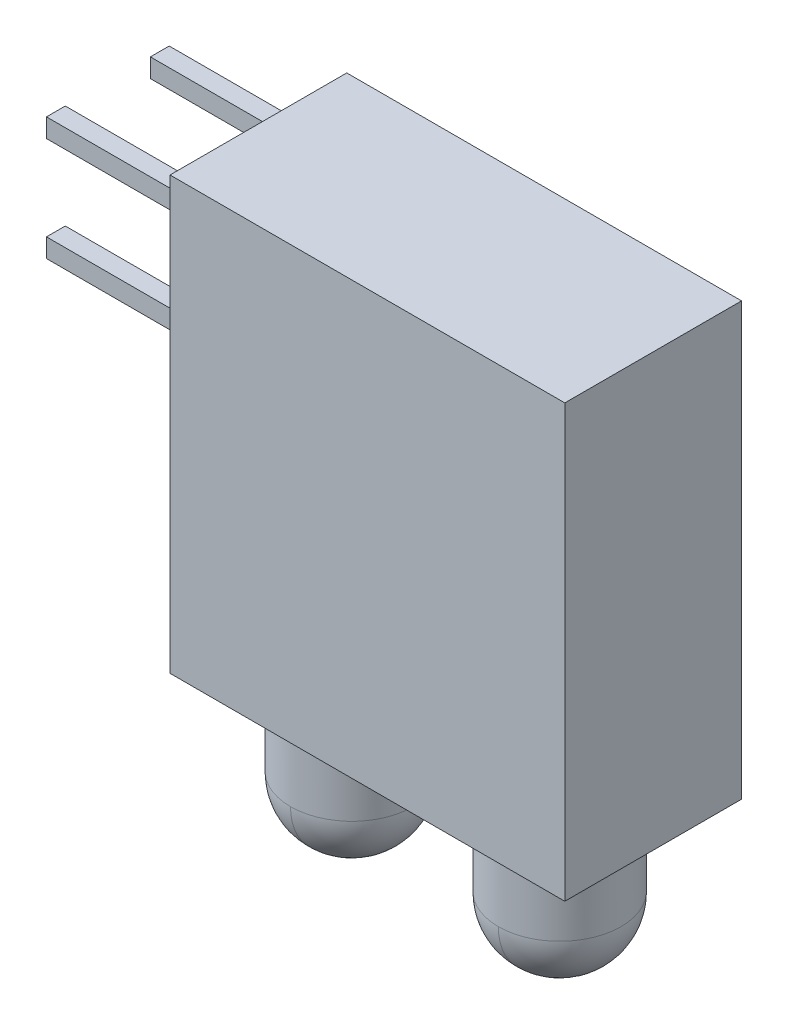
ISO-10303-21;
HEADER;
FILE_DESCRIPTION(('STEP AP214'),'2;1');
FILE_NAME('part.step','',(''),(''),'','','');
FILE_SCHEMA(('AUTOMOTIVE_DESIGN { 1 0 10303 214 1 1 1 1 }'));
ENDSEC;
DATA;
#1=APPLICATION_CONTEXT('core data for automotive mechanical design processes');
#2=APPLICATION_PROTOCOL_DEFINITION('international standard','automotive_design',2000,#1);
#3=PRODUCT_CONTEXT('',#1,'mechanical');
#4=PRODUCT('Part','Part','',(#3));
#5=PRODUCT_RELATED_PRODUCT_CATEGORY('part','',(#4));
#6=PRODUCT_DEFINITION_FORMATION('','',#4);
#7=PRODUCT_DEFINITION_CONTEXT('part definition',#1,'design');
#8=PRODUCT_DEFINITION('design','',#6,#7);
#9=PRODUCT_DEFINITION_SHAPE('','',#8);
#10=(LENGTH_UNIT() NAMED_UNIT(*) SI_UNIT(.MILLI.,.METRE.));
#11=(NAMED_UNIT(*) PLANE_ANGLE_UNIT() SI_UNIT($,.RADIAN.));
#12=(NAMED_UNIT(*) SI_UNIT($,.STERADIAN.) SOLID_ANGLE_UNIT());
#13=UNCERTAINTY_MEASURE_WITH_UNIT(LENGTH_MEASURE(1.E-05),#10,'distance_accuracy_value','');
#14=(GEOMETRIC_REPRESENTATION_CONTEXT(3) GLOBAL_UNCERTAINTY_ASSIGNED_CONTEXT((#13)) GLOBAL_UNIT_ASSIGNED_CONTEXT((#10,
#11,#12)) REPRESENTATION_CONTEXT('',''));
#15=CARTESIAN_POINT('',(0.,0.,0.));
#16=DIRECTION('',(0.,0.,1.));
#17=DIRECTION('',(1.,0.,0.));
#18=AXIS2_PLACEMENT_3D('',#15,#16,#17);
#19=CARTESIAN_POINT('',(15.3632892465154,-35.0510768898671,20.3900000000259));
#20=DIRECTION('',(0.,0.,-1.));
#21=DIRECTION('',(-1.,0.,0.));
#22=AXIS2_PLACEMENT_3D('',#19,#20,#21);
#23=PLANE('',#22);
#24=DIRECTION('',(1.,0.,0.));
#25=VECTOR('',#24,1.);
#26=CARTESIAN_POINT('',(15.3632892465154,-35.0510768898671,20.3900000000259));
#27=LINE('',#26,#25);
#28=CARTESIAN_POINT('',(5.71328924651546,-35.0510768898671,20.3900000000259));
#29=VERTEX_POINT('',#28);
#30=CARTESIAN_POINT('',(15.3632892465154,-35.0510768898671,20.3900000000259));
#31=VERTEX_POINT('',#30);
#32=EDGE_CURVE('E49',#29,#31,#27,.T.);
#33=ORIENTED_EDGE('',*,*,#32,.F.);
#34=DIRECTION('',(0.,1.,0.));
#35=VECTOR('',#34,1.);
#36=CARTESIAN_POINT('',(5.71328924651546,-35.0510768898671,20.3900000000259));
#37=LINE('',#36,#35);
#38=CARTESIAN_POINT('',(5.71328924651546,-45.6010768898671,20.3900000000259));
#39=VERTEX_POINT('',#38);
#40=EDGE_CURVE('E356',#39,#29,#37,.T.);
#41=ORIENTED_EDGE('',*,*,#40,.F.);
#42=DIRECTION('',(-1.,0.,0.));
#43=VECTOR('',#42,1.);
#44=CARTESIAN_POINT('',(15.3632892465154,-45.6010768898671,20.3900000000259));
#45=LINE('',#44,#43);
#46=CARTESIAN_POINT('',(15.3632892465154,-45.6010768898671,20.3900000000259));
#47=VERTEX_POINT('',#46);
#48=EDGE_CURVE('E305',#47,#39,#45,.T.);
#49=ORIENTED_EDGE('',*,*,#48,.F.);
#50=DIRECTION('',(0.,-1.,0.));
#51=VECTOR('',#50,1.);
#52=CARTESIAN_POINT('',(15.3632892465154,-35.0510768898671,20.3900000000259));
#53=LINE('',#52,#51);
#54=EDGE_CURVE('E11',#31,#47,#53,.T.);
#55=ORIENTED_EDGE('',*,*,#54,.F.);
#56=EDGE_LOOP('',(#33,#41,#49,#55));
#57=FACE_BOUND('',#56,.T.);
#58=ADVANCED_FACE('F16',(#57),#23,.F.);
#59=CARTESIAN_POINT('',(15.3632892465154,-40.3260768898671,18.2300000000259));
#60=DIRECTION('',(1.,0.,0.));
#61=DIRECTION('',(0.,1.,0.));
#62=AXIS2_PLACEMENT_3D('',#59,#60,#61);
#63=PLANE('',#62);
#64=DIRECTION('',(0.,0.,1.));
#65=VECTOR('',#64,1.);
#66=CARTESIAN_POINT('',(15.3632892465154,-35.0510768898671,18.2300000000259));
#67=LINE('',#66,#65);
#68=CARTESIAN_POINT('',(15.3632892465154,-35.0510768898671,16.0700000000259));
#69=VERTEX_POINT('',#68);
#70=EDGE_CURVE('E26',#69,#31,#67,.T.);
#71=ORIENTED_EDGE('',*,*,#70,.T.);
#72=ORIENTED_EDGE('',*,*,#54,.T.);
#73=DIRECTION('',(0.,0.,-1.));
#74=VECTOR('',#73,1.);
#75=CARTESIAN_POINT('',(15.3632892465154,-45.6010768898671,18.2300000000259));
#76=LINE('',#75,#74);
#77=CARTESIAN_POINT('',(15.3632892465154,-45.6010768898671,16.0700000000259));
#78=VERTEX_POINT('',#77);
#79=EDGE_CURVE('E205',#47,#78,#76,.T.);
#80=ORIENTED_EDGE('',*,*,#79,.T.);
#81=DIRECTION('',(0.,1.,0.));
#82=VECTOR('',#81,1.);
#83=CARTESIAN_POINT('',(15.3632892465154,-40.3260768898671,16.0700000000259));
#84=LINE('',#83,#82);
#85=EDGE_CURVE('E308',#78,#69,#84,.T.);
#86=ORIENTED_EDGE('',*,*,#85,.T.);
#87=EDGE_LOOP('',(#71,#72,#80,#86));
#88=FACE_BOUND('',#87,.T.);
#89=ADVANCED_FACE('F551',(#88),#63,.T.);
#90=CARTESIAN_POINT('',(15.3632892465154,-35.0510768898671,16.0700000000259));
#91=DIRECTION('',(0.,-1.,0.));
#92=DIRECTION('',(1.,0.,0.));
#93=AXIS2_PLACEMENT_3D('',#90,#91,#92);
#94=PLANE('',#93);
#95=DIRECTION('',(1.,0.,0.));
#96=VECTOR('',#95,1.);
#97=CARTESIAN_POINT('',(15.3632892465154,-35.0510768898671,16.0700000000259));
#98=LINE('',#97,#96);
#99=CARTESIAN_POINT('',(5.71328924651546,-35.0510768898671,16.0700000000259));
#100=VERTEX_POINT('',#99);
#101=EDGE_CURVE('E423',#100,#69,#98,.T.);
#102=ORIENTED_EDGE('',*,*,#101,.F.);
#103=DIRECTION('',(0.,0.,-1.));
#104=VECTOR('',#103,1.);
#105=CARTESIAN_POINT('',(5.71328924651546,-35.0510768898671,16.0700000000259));
#106=LINE('',#105,#104);
#107=EDGE_CURVE('E353',#29,#100,#106,.T.);
#108=ORIENTED_EDGE('',*,*,#107,.F.);
#109=ORIENTED_EDGE('',*,*,#32,.T.);
#110=ORIENTED_EDGE('',*,*,#70,.F.);
#111=EDGE_LOOP('',(#102,#108,#109,#110));
#112=FACE_BOUND('',#111,.T.);
#113=ADVANCED_FACE('F545',(#112),#94,.F.);
#114=CARTESIAN_POINT('',(5.71328924651546,-40.3260768898671,18.2300000000259));
#115=DIRECTION('',(1.,0.,0.));
#116=DIRECTION('',(0.,1.,0.));
#117=AXIS2_PLACEMENT_3D('',#114,#115,#116);
#118=PLANE('',#117);
#119=DIRECTION('',(0.,-1.,0.));
#120=VECTOR('',#119,1.);
#121=CARTESIAN_POINT('',(5.71328924651546,-36.4510768898671,19.7300000000259));
#122=LINE('',#121,#120);
#123=CARTESIAN_POINT('',(5.71328924651546,-35.9910768898671,19.7300000000259));
#124=VERTEX_POINT('',#123);
#125=CARTESIAN_POINT('',(5.71328924651546,-36.4510768898671,19.7300000000259));
#126=VERTEX_POINT('',#125);
#127=EDGE_CURVE('E303',#124,#126,#122,.T.);
#128=ORIENTED_EDGE('',*,*,#127,.T.);
#129=DIRECTION('',(0.,0.,-1.));
#130=VECTOR('',#129,1.);
#131=CARTESIAN_POINT('',(5.71328924651546,-36.4510768898671,19.2700000000259));
#132=LINE('',#131,#130);
#133=CARTESIAN_POINT('',(5.71328924651546,-36.4510768898671,19.2700000000259));
#134=VERTEX_POINT('',#133);
#135=EDGE_CURVE('E326',#126,#134,#132,.T.);
#136=ORIENTED_EDGE('',*,*,#135,.T.);
#137=DIRECTION('',(0.,1.,0.));
#138=VECTOR('',#137,1.);
#139=CARTESIAN_POINT('',(5.71328924651546,-35.9910768898671,19.2700000000259));
#140=LINE('',#139,#138);
#141=CARTESIAN_POINT('',(5.71328924651546,-35.9910768898671,19.2700000000259));
#142=VERTEX_POINT('',#141);
#143=EDGE_CURVE('E304',#134,#142,#140,.T.);
#144=ORIENTED_EDGE('',*,*,#143,.T.);
#145=DIRECTION('',(0.,0.,-1.));
#146=VECTOR('',#145,1.);
#147=CARTESIAN_POINT('',(5.71328924651546,-35.9910768898671,18.2300000000259));
#148=LINE('',#147,#146);
#149=EDGE_CURVE('E272',#124,#142,#148,.T.);
#150=ORIENTED_EDGE('',*,*,#149,.F.);
#151=EDGE_LOOP('',(#128,#136,#144,#150));
#152=FACE_BOUND('',#151,.T.);
#153=DIRECTION('',(0.,-1.,0.));
#154=VECTOR('',#153,1.);
#155=CARTESIAN_POINT('',(5.71328924651546,-38.9910768898671,19.7300000000259));
#156=LINE('',#155,#154);
#157=CARTESIAN_POINT('',(5.71328924651546,-38.5310768898671,19.7300000000259));
#158=VERTEX_POINT('',#157);
#159=CARTESIAN_POINT('',(5.71328924651546,-38.9910768898671,19.7300000000259));
#160=VERTEX_POINT('',#159);
#161=EDGE_CURVE('E312',#158,#160,#156,.T.);
#162=ORIENTED_EDGE('',*,*,#161,.T.);
#163=DIRECTION('',(0.,0.,-1.));
#164=VECTOR('',#163,1.);
#165=CARTESIAN_POINT('',(5.71328924651546,-38.9910768898671,19.2700000000259));
#166=LINE('',#165,#164);
#167=CARTESIAN_POINT('',(5.71328924651546,-38.9910768898671,19.2700000000259));
#168=VERTEX_POINT('',#167);
#169=EDGE_CURVE('E347',#160,#168,#166,.T.);
#170=ORIENTED_EDGE('',*,*,#169,.T.);
#171=DIRECTION('',(0.,1.,0.));
#172=VECTOR('',#171,1.);
#173=CARTESIAN_POINT('',(5.71328924651546,-38.5310768898671,19.2700000000259));
#174=LINE('',#173,#172);
#175=CARTESIAN_POINT('',(5.71328924651546,-38.5310768898671,19.2700000000259));
#176=VERTEX_POINT('',#175);
#177=EDGE_CURVE('E405',#168,#176,#174,.T.);
#178=ORIENTED_EDGE('',*,*,#177,.T.);
#179=DIRECTION('',(0.,0.,-1.));
#180=VECTOR('',#179,1.);
#181=CARTESIAN_POINT('',(5.71328924651546,-38.5310768898671,18.2300000000259));
#182=LINE('',#181,#180);
#183=EDGE_CURVE('E276',#158,#176,#182,.T.);
#184=ORIENTED_EDGE('',*,*,#183,.F.);
#185=EDGE_LOOP('',(#162,#170,#178,#184));
#186=FACE_BOUND('',#185,.T.);
#187=DIRECTION('',(0.,-1.,0.));
#188=VECTOR('',#187,1.);
#189=CARTESIAN_POINT('',(5.71328924651546,-36.4510768898671,17.1900000000259));
#190=LINE('',#189,#188);
#191=CARTESIAN_POINT('',(5.71328924651546,-35.9910768898671,17.1900000000259));
#192=VERTEX_POINT('',#191);
#193=CARTESIAN_POINT('',(5.71328924651546,-36.4510768898671,17.1900000000259));
#194=VERTEX_POINT('',#193);
#195=EDGE_CURVE('E254',#192,#194,#190,.T.);
#196=ORIENTED_EDGE('',*,*,#195,.T.);
#197=DIRECTION('',(0.,0.,-1.));
#198=VECTOR('',#197,1.);
#199=CARTESIAN_POINT('',(5.71328924651546,-36.4510768898671,16.7300000000259));
#200=LINE('',#199,#198);
#201=CARTESIAN_POINT('',(5.71328924651546,-36.4510768898671,16.7300000000259));
#202=VERTEX_POINT('',#201);
#203=EDGE_CURVE('E368',#194,#202,#200,.T.);
#204=ORIENTED_EDGE('',*,*,#203,.T.);
#205=DIRECTION('',(0.,1.,0.));
#206=VECTOR('',#205,1.);
#207=CARTESIAN_POINT('',(5.71328924651546,-35.9910768898671,16.7300000000259));
#208=LINE('',#207,#206);
#209=CARTESIAN_POINT('',(5.71328924651546,-35.9910768898671,16.7300000000259));
#210=VERTEX_POINT('',#209);
#211=EDGE_CURVE('E341',#202,#210,#208,.T.);
#212=ORIENTED_EDGE('',*,*,#211,.T.);
#213=DIRECTION('',(0.,0.,-1.));
#214=VECTOR('',#213,1.);
#215=CARTESIAN_POINT('',(5.71328924651546,-35.9910768898671,18.2300000000259));
#216=LINE('',#215,#214);
#217=EDGE_CURVE('E346',#192,#210,#216,.T.);
#218=ORIENTED_EDGE('',*,*,#217,.F.);
#219=EDGE_LOOP('',(#196,#204,#212,#218));
#220=FACE_BOUND('',#219,.T.);
#221=DIRECTION('',(0.,-1.,0.));
#222=VECTOR('',#221,1.);
#223=CARTESIAN_POINT('',(5.71328924651546,-38.9910768898671,17.1900000000259));
#224=LINE('',#223,#222);
#225=CARTESIAN_POINT('',(5.71328924651546,-38.5310768898671,17.1900000000259));
#226=VERTEX_POINT('',#225);
#227=CARTESIAN_POINT('',(5.71328924651546,-38.9910768898671,17.1900000000259));
#228=VERTEX_POINT('',#227);
#229=EDGE_CURVE('E292',#226,#228,#224,.T.);
#230=ORIENTED_EDGE('',*,*,#229,.T.);
#231=DIRECTION('',(0.,0.,-1.));
#232=VECTOR('',#231,1.);
#233=CARTESIAN_POINT('',(5.71328924651546,-38.9910768898671,16.7300000000259));
#234=LINE('',#233,#232);
#235=CARTESIAN_POINT('',(5.71328924651546,-38.9910768898671,16.7300000000259));
#236=VERTEX_POINT('',#235);
#237=EDGE_CURVE('E287',#228,#236,#234,.T.);
#238=ORIENTED_EDGE('',*,*,#237,.T.);
#239=DIRECTION('',(0.,1.,0.));
#240=VECTOR('',#239,1.);
#241=CARTESIAN_POINT('',(5.71328924651546,-38.5310768898671,16.7300000000259));
#242=LINE('',#241,#240);
#243=CARTESIAN_POINT('',(5.71328924651546,-38.5310768898671,16.7300000000259));
#244=VERTEX_POINT('',#243);
#245=EDGE_CURVE('E293',#236,#244,#242,.T.);
#246=ORIENTED_EDGE('',*,*,#245,.T.);
#247=DIRECTION('',(0.,0.,-1.));
#248=VECTOR('',#247,1.);
#249=CARTESIAN_POINT('',(5.71328924651546,-38.5310768898671,18.2300000000259));
#250=LINE('',#249,#248);
#251=EDGE_CURVE('E342',#226,#244,#250,.T.);
#252=ORIENTED_EDGE('',*,*,#251,.F.);
#253=EDGE_LOOP('',(#230,#238,#246,#252));
#254=FACE_BOUND('',#253,.T.);
#255=DIRECTION('',(0.,1.,0.));
#256=VECTOR('',#255,1.);
#257=CARTESIAN_POINT('',(5.71328924651546,-40.3260768898671,16.0700000000259));
#258=LINE('',#257,#256);
#259=CARTESIAN_POINT('',(5.71328924651546,-45.6010768898671,16.0700000000259));
#260=VERTEX_POINT('',#259);
#261=EDGE_CURVE('E419',#260,#100,#258,.T.);
#262=ORIENTED_EDGE('',*,*,#261,.F.);
#263=DIRECTION('',(0.,0.,-1.));
#264=VECTOR('',#263,1.);
#265=CARTESIAN_POINT('',(5.71328924651546,-45.6010768898671,18.2300000000259));
#266=LINE('',#265,#264);
#267=EDGE_CURVE('E193',#39,#260,#266,.T.);
#268=ORIENTED_EDGE('',*,*,#267,.F.);
#269=ORIENTED_EDGE('',*,*,#40,.T.);
#270=ORIENTED_EDGE('',*,*,#107,.T.);
#271=EDGE_LOOP('',(#262,#268,#269,#270));
#272=FACE_BOUND('',#271,.T.);
#273=ADVANCED_FACE('F550',(#152,#186,#220,#254,#272),#118,.F.);
#274=CARTESIAN_POINT('',(15.3632892465154,-45.6010768898671,20.3900000000259));
#275=DIRECTION('',(0.,1.,0.));
#276=DIRECTION('',(0.,0.,1.));
#277=AXIS2_PLACEMENT_3D('',#274,#275,#276);
#278=PLANE('',#277);
#279=CARTESIAN_POINT('',(13.0782892465155,-45.6010768898671,18.2300000000259));
#280=DIRECTION('',(0.,-1.,0.));
#281=DIRECTION('',(1.,0.,0.));
#282=AXIS2_PLACEMENT_3D('',#279,#280,#281);
#283=CIRCLE('',#282,1.5);
#284=CARTESIAN_POINT('',(11.5782892465155,-45.6010768898671,18.2300000000259));
#285=VERTEX_POINT('',#284);
#286=EDGE_CURVE('E397',#285,#285,#283,.T.);
#287=ORIENTED_EDGE('',*,*,#286,.F.);
#288=EDGE_LOOP('',(#287));
#289=FACE_BOUND('',#288,.T.);
#290=CARTESIAN_POINT('',(7.99828924651546,-45.6010768898671,18.2300000000259));
#291=DIRECTION('',(0.,-1.,0.));
#292=DIRECTION('',(1.,0.,0.));
#293=AXIS2_PLACEMENT_3D('',#290,#291,#292);
#294=CIRCLE('',#293,1.5);
#295=CARTESIAN_POINT('',(6.49828924651546,-45.6010768898671,18.2300000000259));
#296=VERTEX_POINT('',#295);
#297=EDGE_CURVE('E316',#296,#296,#294,.T.);
#298=ORIENTED_EDGE('',*,*,#297,.F.);
#299=EDGE_LOOP('',(#298));
#300=FACE_BOUND('',#299,.T.);
#301=ORIENTED_EDGE('',*,*,#48,.T.);
#302=ORIENTED_EDGE('',*,*,#267,.T.);
#303=DIRECTION('',(-1.,0.,0.));
#304=VECTOR('',#303,1.);
#305=CARTESIAN_POINT('',(15.3632892465154,-45.6010768898671,16.0700000000259));
#306=LINE('',#305,#304);
#307=EDGE_CURVE('E345',#78,#260,#306,.T.);
#308=ORIENTED_EDGE('',*,*,#307,.F.);
#309=ORIENTED_EDGE('',*,*,#79,.F.);
#310=EDGE_LOOP('',(#301,#302,#308,#309));
#311=FACE_BOUND('',#310,.T.);
#312=ADVANCED_FACE('F534',(#289,#300,#311),#278,.F.);
#313=CARTESIAN_POINT('',(15.3632892465154,-45.6010768898671,16.0700000000259));
#314=DIRECTION('',(0.,0.,1.));
#315=DIRECTION('',(0.,1.,0.));
#316=AXIS2_PLACEMENT_3D('',#313,#314,#315);
#317=PLANE('',#316);
#318=ORIENTED_EDGE('',*,*,#307,.T.);
#319=ORIENTED_EDGE('',*,*,#261,.T.);
#320=ORIENTED_EDGE('',*,*,#101,.T.);
#321=ORIENTED_EDGE('',*,*,#85,.F.);
#322=EDGE_LOOP('',(#318,#319,#320,#321));
#323=FACE_BOUND('',#322,.T.);
#324=ADVANCED_FACE('F529',(#323),#317,.F.);
#325=CARTESIAN_POINT('',(2.03328924651546,-38.5310768898671,17.1900000000259));
#326=DIRECTION('',(0.,-1.,0.));
#327=DIRECTION('',(1.,0.,0.));
#328=AXIS2_PLACEMENT_3D('',#325,#326,#327);
#329=PLANE('',#328);
#330=DIRECTION('',(-1.,0.,0.));
#331=VECTOR('',#330,1.);
#332=CARTESIAN_POINT('',(2.03328924651546,-38.5310768898671,17.1900000000259));
#333=LINE('',#332,#331);
#334=CARTESIAN_POINT('',(2.03328924651546,-38.5310768898671,17.1900000000259));
#335=VERTEX_POINT('',#334);
#336=EDGE_CURVE('E430',#226,#335,#333,.T.);
#337=ORIENTED_EDGE('',*,*,#336,.F.);
#338=ORIENTED_EDGE('',*,*,#251,.T.);
#339=DIRECTION('',(1.,0.,0.));
#340=VECTOR('',#339,1.);
#341=CARTESIAN_POINT('',(2.03328924651546,-38.5310768898671,16.7300000000259));
#342=LINE('',#341,#340);
#343=CARTESIAN_POINT('',(2.03328924651546,-38.5310768898671,16.7300000000259));
#344=VERTEX_POINT('',#343);
#345=EDGE_CURVE('E242',#344,#244,#342,.T.);
#346=ORIENTED_EDGE('',*,*,#345,.F.);
#347=DIRECTION('',(0.,0.,-1.));
#348=VECTOR('',#347,1.);
#349=CARTESIAN_POINT('',(2.03328924651546,-38.5310768898671,17.1900000000259));
#350=LINE('',#349,#348);
#351=EDGE_CURVE('E277',#335,#344,#350,.T.);
#352=ORIENTED_EDGE('',*,*,#351,.F.);
#353=EDGE_LOOP('',(#337,#338,#346,#352));
#354=FACE_BOUND('',#353,.T.);
#355=ADVANCED_FACE('F480',(#354),#329,.F.);
#356=CARTESIAN_POINT('',(2.03328924651546,-35.9910768898671,17.1900000000259));
#357=DIRECTION('',(0.,-1.,0.));
#358=DIRECTION('',(1.,0.,0.));
#359=AXIS2_PLACEMENT_3D('',#356,#357,#358);
#360=PLANE('',#359);
#361=DIRECTION('',(-1.,0.,0.));
#362=VECTOR('',#361,1.);
#363=CARTESIAN_POINT('',(2.03328924651546,-35.9910768898671,17.1900000000259));
#364=LINE('',#363,#362);
#365=CARTESIAN_POINT('',(2.03328924651546,-35.9910768898671,17.1900000000259));
#366=VERTEX_POINT('',#365);
#367=EDGE_CURVE('E235',#192,#366,#364,.T.);
#368=ORIENTED_EDGE('',*,*,#367,.F.);
#369=ORIENTED_EDGE('',*,*,#217,.T.);
#370=DIRECTION('',(1.,0.,0.));
#371=VECTOR('',#370,1.);
#372=CARTESIAN_POINT('',(2.03328924651546,-35.9910768898671,16.7300000000259));
#373=LINE('',#372,#371);
#374=CARTESIAN_POINT('',(2.03328924651546,-35.9910768898671,16.7300000000259));
#375=VERTEX_POINT('',#374);
#376=EDGE_CURVE('E238',#375,#210,#373,.T.);
#377=ORIENTED_EDGE('',*,*,#376,.F.);
#378=DIRECTION('',(0.,0.,-1.));
#379=VECTOR('',#378,1.);
#380=CARTESIAN_POINT('',(2.03328924651546,-35.9910768898671,17.1900000000259));
#381=LINE('',#380,#379);
#382=EDGE_CURVE('E231',#366,#375,#381,.T.);
#383=ORIENTED_EDGE('',*,*,#382,.F.);
#384=EDGE_LOOP('',(#368,#369,#377,#383));
#385=FACE_BOUND('',#384,.T.);
#386=ADVANCED_FACE('F233',(#385),#360,.F.);
#387=CARTESIAN_POINT('',(2.03328924651546,-38.5310768898671,19.7300000000259));
#388=DIRECTION('',(0.,-1.,0.));
#389=DIRECTION('',(1.,0.,0.));
#390=AXIS2_PLACEMENT_3D('',#387,#388,#389);
#391=PLANE('',#390);
#392=DIRECTION('',(-1.,0.,0.));
#393=VECTOR('',#392,1.);
#394=CARTESIAN_POINT('',(2.03328924651546,-38.5310768898671,19.7300000000259));
#395=LINE('',#394,#393);
#396=CARTESIAN_POINT('',(2.03328924651546,-38.5310768898671,19.7300000000259));
#397=VERTEX_POINT('',#396);
#398=EDGE_CURVE('E283',#158,#397,#395,.T.);
#399=ORIENTED_EDGE('',*,*,#398,.F.);
#400=ORIENTED_EDGE('',*,*,#183,.T.);
#401=DIRECTION('',(1.,0.,0.));
#402=VECTOR('',#401,1.);
#403=CARTESIAN_POINT('',(2.03328924651546,-38.5310768898671,19.2700000000259));
#404=LINE('',#403,#402);
#405=CARTESIAN_POINT('',(2.03328924651546,-38.5310768898671,19.2700000000259));
#406=VERTEX_POINT('',#405);
#407=EDGE_CURVE('E269',#406,#176,#404,.T.);
#408=ORIENTED_EDGE('',*,*,#407,.F.);
#409=DIRECTION('',(0.,0.,-1.));
#410=VECTOR('',#409,1.);
#411=CARTESIAN_POINT('',(2.03328924651546,-38.5310768898671,19.7300000000259));
#412=LINE('',#411,#410);
#413=EDGE_CURVE('E282',#397,#406,#412,.T.);
#414=ORIENTED_EDGE('',*,*,#413,.F.);
#415=EDGE_LOOP('',(#399,#400,#408,#414));
#416=FACE_BOUND('',#415,.T.);
#417=ADVANCED_FACE('F653',(#416),#391,.F.);
#418=CARTESIAN_POINT('',(2.03328924651546,-35.9910768898671,19.7300000000259));
#419=DIRECTION('',(0.,-1.,0.));
#420=DIRECTION('',(1.,0.,0.));
#421=AXIS2_PLACEMENT_3D('',#418,#419,#420);
#422=PLANE('',#421);
#423=DIRECTION('',(-1.,0.,0.));
#424=VECTOR('',#423,1.);
#425=CARTESIAN_POINT('',(2.03328924651546,-35.9910768898671,19.7300000000259));
#426=LINE('',#425,#424);
#427=CARTESIAN_POINT('',(2.03328924651546,-35.9910768898671,19.7300000000259));
#428=VERTEX_POINT('',#427);
#429=EDGE_CURVE('E335',#124,#428,#426,.T.);
#430=ORIENTED_EDGE('',*,*,#429,.F.);
#431=ORIENTED_EDGE('',*,*,#149,.T.);
#432=DIRECTION('',(1.,0.,0.));
#433=VECTOR('',#432,1.);
#434=CARTESIAN_POINT('',(2.03328924651546,-35.9910768898671,19.2700000000259));
#435=LINE('',#434,#433);
#436=CARTESIAN_POINT('',(2.03328924651546,-35.9910768898671,19.2700000000259));
#437=VERTEX_POINT('',#436);
#438=EDGE_CURVE('E357',#437,#142,#435,.T.);
#439=ORIENTED_EDGE('',*,*,#438,.F.);
#440=DIRECTION('',(0.,0.,-1.));
#441=VECTOR('',#440,1.);
#442=CARTESIAN_POINT('',(2.03328924651546,-35.9910768898671,19.7300000000259));
#443=LINE('',#442,#441);
#444=EDGE_CURVE('E268',#428,#437,#443,.T.);
#445=ORIENTED_EDGE('',*,*,#444,.F.);
#446=EDGE_LOOP('',(#430,#431,#439,#445));
#447=FACE_BOUND('',#446,.T.);
#448=ADVANCED_FACE('F648',(#447),#422,.F.);
#449=CARTESIAN_POINT('',(2.03328924651546,-40.3260768898671,18.2300000000259));
#450=DIRECTION('',(-1.,0.,0.));
#451=DIRECTION('',(0.,0.,-1.));
#452=AXIS2_PLACEMENT_3D('',#449,#450,#451);
#453=PLANE('',#452);
#454=ORIENTED_EDGE('',*,*,#351,.T.);
#455=DIRECTION('',(0.,-1.,0.));
#456=VECTOR('',#455,1.);
#457=CARTESIAN_POINT('',(2.03328924651546,-40.3260768898671,16.7300000000259));
#458=LINE('',#457,#456);
#459=CARTESIAN_POINT('',(2.03328924651546,-38.9910768898671,16.7300000000259));
#460=VERTEX_POINT('',#459);
#461=EDGE_CURVE('E289',#344,#460,#458,.T.);
#462=ORIENTED_EDGE('',*,*,#461,.T.);
#463=DIRECTION('',(0.,0.,1.));
#464=VECTOR('',#463,1.);
#465=CARTESIAN_POINT('',(2.03328924651546,-38.9910768898671,16.7300000000259));
#466=LINE('',#465,#464);
#467=CARTESIAN_POINT('',(2.03328924651546,-38.9910768898671,17.1900000000259));
#468=VERTEX_POINT('',#467);
#469=EDGE_CURVE('E361',#460,#468,#466,.T.);
#470=ORIENTED_EDGE('',*,*,#469,.T.);
#471=DIRECTION('',(0.,1.,0.));
#472=VECTOR('',#471,1.);
#473=CARTESIAN_POINT('',(2.03328924651546,-40.3260768898671,17.1900000000259));
#474=LINE('',#473,#472);
#475=EDGE_CURVE('E311',#468,#335,#474,.T.);
#476=ORIENTED_EDGE('',*,*,#475,.T.);
#477=EDGE_LOOP('',(#454,#462,#470,#476));
#478=FACE_BOUND('',#477,.T.);
#479=ADVANCED_FACE('F472',(#478),#453,.T.);
#480=CARTESIAN_POINT('',(2.03328924651546,-38.9910768898671,17.1900000000259));
#481=DIRECTION('',(0.,0.,-1.));
#482=DIRECTION('',(-1.,0.,0.));
#483=AXIS2_PLACEMENT_3D('',#480,#481,#482);
#484=PLANE('',#483);
#485=DIRECTION('',(-1.,0.,0.));
#486=VECTOR('',#485,1.);
#487=CARTESIAN_POINT('',(2.03328924651546,-38.9910768898671,17.1900000000259));
#488=LINE('',#487,#486);
#489=EDGE_CURVE('E369',#228,#468,#488,.T.);
#490=ORIENTED_EDGE('',*,*,#489,.F.);
#491=ORIENTED_EDGE('',*,*,#229,.F.);
#492=ORIENTED_EDGE('',*,*,#336,.T.);
#493=ORIENTED_EDGE('',*,*,#475,.F.);
#494=EDGE_LOOP('',(#490,#491,#492,#493));
#495=FACE_BOUND('',#494,.T.);
#496=ADVANCED_FACE('F18',(#495),#484,.F.);
#497=CARTESIAN_POINT('',(2.03328924651546,-38.5310768898671,16.7300000000259));
#498=DIRECTION('',(0.,0.,1.));
#499=DIRECTION('',(0.,1.,0.));
#500=AXIS2_PLACEMENT_3D('',#497,#498,#499);
#501=PLANE('',#500);
#502=ORIENTED_EDGE('',*,*,#345,.T.);
#503=ORIENTED_EDGE('',*,*,#245,.F.);
#504=DIRECTION('',(1.,0.,0.));
#505=VECTOR('',#504,1.);
#506=CARTESIAN_POINT('',(2.03328924651546,-38.9910768898671,16.7300000000259));
#507=LINE('',#506,#505);
#508=EDGE_CURVE('E284',#460,#236,#507,.T.);
#509=ORIENTED_EDGE('',*,*,#508,.F.);
#510=ORIENTED_EDGE('',*,*,#461,.F.);
#511=EDGE_LOOP('',(#502,#503,#509,#510));
#512=FACE_BOUND('',#511,.T.);
#513=ADVANCED_FACE('F483',(#512),#501,.F.);
#514=CARTESIAN_POINT('',(2.03328924651546,-40.3260768898671,18.2300000000259));
#515=DIRECTION('',(-1.,0.,0.));
#516=DIRECTION('',(0.,0.,-1.));
#517=AXIS2_PLACEMENT_3D('',#514,#515,#516);
#518=PLANE('',#517);
#519=ORIENTED_EDGE('',*,*,#382,.T.);
#520=DIRECTION('',(0.,-1.,0.));
#521=VECTOR('',#520,1.);
#522=CARTESIAN_POINT('',(2.03328924651546,-40.3260768898671,16.7300000000259));
#523=LINE('',#522,#521);
#524=CARTESIAN_POINT('',(2.03328924651546,-36.4510768898671,16.7300000000259));
#525=VERTEX_POINT('',#524);
#526=EDGE_CURVE('E262',#375,#525,#523,.T.);
#527=ORIENTED_EDGE('',*,*,#526,.T.);
#528=DIRECTION('',(0.,0.,1.));
#529=VECTOR('',#528,1.);
#530=CARTESIAN_POINT('',(2.03328924651546,-36.4510768898671,16.7300000000259));
#531=LINE('',#530,#529);
#532=CARTESIAN_POINT('',(2.03328924651546,-36.4510768898671,17.1900000000259));
#533=VERTEX_POINT('',#532);
#534=EDGE_CURVE('E20',#525,#533,#531,.T.);
#535=ORIENTED_EDGE('',*,*,#534,.T.);
#536=DIRECTION('',(0.,1.,0.));
#537=VECTOR('',#536,1.);
#538=CARTESIAN_POINT('',(2.03328924651546,-40.3260768898671,17.1900000000259));
#539=LINE('',#538,#537);
#540=EDGE_CURVE('E243',#533,#366,#539,.T.);
#541=ORIENTED_EDGE('',*,*,#540,.T.);
#542=EDGE_LOOP('',(#519,#527,#535,#541));
#543=FACE_BOUND('',#542,.T.);
#544=ADVANCED_FACE('F246',(#543),#518,.T.);
#545=CARTESIAN_POINT('',(2.03328924651546,-36.4510768898671,17.1900000000259));
#546=DIRECTION('',(0.,0.,-1.));
#547=DIRECTION('',(-1.,0.,0.));
#548=AXIS2_PLACEMENT_3D('',#545,#546,#547);
#549=PLANE('',#548);
#550=DIRECTION('',(-1.,0.,0.));
#551=VECTOR('',#550,1.);
#552=CARTESIAN_POINT('',(2.03328924651546,-36.4510768898671,17.1900000000259));
#553=LINE('',#552,#551);
#554=EDGE_CURVE('E412',#194,#533,#553,.T.);
#555=ORIENTED_EDGE('',*,*,#554,.F.);
#556=ORIENTED_EDGE('',*,*,#195,.F.);
#557=ORIENTED_EDGE('',*,*,#367,.T.);
#558=ORIENTED_EDGE('',*,*,#540,.F.);
#559=EDGE_LOOP('',(#555,#556,#557,#558));
#560=FACE_BOUND('',#559,.T.);
#561=ADVANCED_FACE('F253',(#560),#549,.F.);
#562=CARTESIAN_POINT('',(2.03328924651546,-35.9910768898671,16.7300000000259));
#563=DIRECTION('',(0.,0.,1.));
#564=DIRECTION('',(0.,1.,0.));
#565=AXIS2_PLACEMENT_3D('',#562,#563,#564);
#566=PLANE('',#565);
#567=ORIENTED_EDGE('',*,*,#376,.T.);
#568=ORIENTED_EDGE('',*,*,#211,.F.);
#569=DIRECTION('',(1.,0.,0.));
#570=VECTOR('',#569,1.);
#571=CARTESIAN_POINT('',(2.03328924651546,-36.4510768898671,16.7300000000259));
#572=LINE('',#571,#570);
#573=EDGE_CURVE('E364',#525,#202,#572,.T.);
#574=ORIENTED_EDGE('',*,*,#573,.F.);
#575=ORIENTED_EDGE('',*,*,#526,.F.);
#576=EDGE_LOOP('',(#567,#568,#574,#575));
#577=FACE_BOUND('',#576,.T.);
#578=ADVANCED_FACE('F697',(#577),#566,.F.);
#579=CARTESIAN_POINT('',(2.03328924651546,-40.3260768898671,18.2300000000259));
#580=DIRECTION('',(-1.,0.,0.));
#581=DIRECTION('',(0.,0.,-1.));
#582=AXIS2_PLACEMENT_3D('',#579,#580,#581);
#583=PLANE('',#582);
#584=ORIENTED_EDGE('',*,*,#413,.T.);
#585=DIRECTION('',(0.,-1.,0.));
#586=VECTOR('',#585,1.);
#587=CARTESIAN_POINT('',(2.03328924651546,-40.3260768898671,19.2700000000259));
#588=LINE('',#587,#586);
#589=CARTESIAN_POINT('',(2.03328924651546,-38.9910768898671,19.2700000000259));
#590=VERTEX_POINT('',#589);
#591=EDGE_CURVE('E315',#406,#590,#588,.T.);
#592=ORIENTED_EDGE('',*,*,#591,.T.);
#593=DIRECTION('',(0.,0.,1.));
#594=VECTOR('',#593,1.);
#595=CARTESIAN_POINT('',(2.03328924651546,-38.9910768898671,19.2700000000259));
#596=LINE('',#595,#594);
#597=CARTESIAN_POINT('',(2.03328924651546,-38.9910768898671,19.7300000000259));
#598=VERTEX_POINT('',#597);
#599=EDGE_CURVE('E266',#590,#598,#596,.T.);
#600=ORIENTED_EDGE('',*,*,#599,.T.);
#601=DIRECTION('',(0.,1.,0.));
#602=VECTOR('',#601,1.);
#603=CARTESIAN_POINT('',(2.03328924651546,-40.3260768898671,19.7300000000259));
#604=LINE('',#603,#602);
#605=EDGE_CURVE('E278',#598,#397,#604,.T.);
#606=ORIENTED_EDGE('',*,*,#605,.T.);
#607=EDGE_LOOP('',(#584,#592,#600,#606));
#608=FACE_BOUND('',#607,.T.);
#609=ADVANCED_FACE('F605',(#608),#583,.T.);
#610=CARTESIAN_POINT('',(2.03328924651546,-38.9910768898671,19.7300000000259));
#611=DIRECTION('',(0.,0.,-1.));
#612=DIRECTION('',(-1.,0.,0.));
#613=AXIS2_PLACEMENT_3D('',#610,#611,#612);
#614=PLANE('',#613);
#615=DIRECTION('',(-1.,0.,0.));
#616=VECTOR('',#615,1.);
#617=CARTESIAN_POINT('',(2.03328924651546,-38.9910768898671,19.7300000000259));
#618=LINE('',#617,#616);
#619=EDGE_CURVE('E351',#160,#598,#618,.T.);
#620=ORIENTED_EDGE('',*,*,#619,.F.);
#621=ORIENTED_EDGE('',*,*,#161,.F.);
#622=ORIENTED_EDGE('',*,*,#398,.T.);
#623=ORIENTED_EDGE('',*,*,#605,.F.);
#624=EDGE_LOOP('',(#620,#621,#622,#623));
#625=FACE_BOUND('',#624,.T.);
#626=ADVANCED_FACE('F599',(#625),#614,.F.);
#627=CARTESIAN_POINT('',(2.03328924651546,-38.5310768898671,19.2700000000259));
#628=DIRECTION('',(0.,0.,1.));
#629=DIRECTION('',(0.,1.,0.));
#630=AXIS2_PLACEMENT_3D('',#627,#628,#629);
#631=PLANE('',#630);
#632=ORIENTED_EDGE('',*,*,#407,.T.);
#633=ORIENTED_EDGE('',*,*,#177,.F.);
#634=DIRECTION('',(1.,0.,0.));
#635=VECTOR('',#634,1.);
#636=CARTESIAN_POINT('',(2.03328924651546,-38.9910768898671,19.2700000000259));
#637=LINE('',#636,#635);
#638=EDGE_CURVE('E352',#590,#168,#637,.T.);
#639=ORIENTED_EDGE('',*,*,#638,.F.);
#640=ORIENTED_EDGE('',*,*,#591,.F.);
#641=EDGE_LOOP('',(#632,#633,#639,#640));
#642=FACE_BOUND('',#641,.T.);
#643=ADVANCED_FACE('F604',(#642),#631,.F.);
#644=CARTESIAN_POINT('',(2.03328924651546,-40.3260768898671,18.2300000000259));
#645=DIRECTION('',(-1.,0.,0.));
#646=DIRECTION('',(0.,0.,-1.));
#647=AXIS2_PLACEMENT_3D('',#644,#645,#646);
#648=PLANE('',#647);
#649=ORIENTED_EDGE('',*,*,#444,.T.);
#650=DIRECTION('',(0.,-1.,0.));
#651=VECTOR('',#650,1.);
#652=CARTESIAN_POINT('',(2.03328924651546,-40.3260768898671,19.2700000000259));
#653=LINE('',#652,#651);
#654=CARTESIAN_POINT('',(2.03328924651546,-36.4510768898671,19.2700000000259));
#655=VERTEX_POINT('',#654);
#656=EDGE_CURVE('E300',#437,#655,#653,.T.);
#657=ORIENTED_EDGE('',*,*,#656,.T.);
#658=DIRECTION('',(0.,0.,1.));
#659=VECTOR('',#658,1.);
#660=CARTESIAN_POINT('',(2.03328924651546,-36.4510768898671,19.2700000000259));
#661=LINE('',#660,#659);
#662=CARTESIAN_POINT('',(2.03328924651546,-36.4510768898671,19.7300000000259));
#663=VERTEX_POINT('',#662);
#664=EDGE_CURVE('E390',#655,#663,#661,.T.);
#665=ORIENTED_EDGE('',*,*,#664,.T.);
#666=DIRECTION('',(0.,1.,0.));
#667=VECTOR('',#666,1.);
#668=CARTESIAN_POINT('',(2.03328924651546,-40.3260768898671,19.7300000000259));
#669=LINE('',#668,#667);
#670=EDGE_CURVE('E270',#663,#428,#669,.T.);
#671=ORIENTED_EDGE('',*,*,#670,.T.);
#672=EDGE_LOOP('',(#649,#657,#665,#671));
#673=FACE_BOUND('',#672,.T.);
#674=ADVANCED_FACE('F622',(#673),#648,.T.);
#675=CARTESIAN_POINT('',(2.03328924651546,-36.4510768898671,19.7300000000259));
#676=DIRECTION('',(0.,0.,-1.));
#677=DIRECTION('',(-1.,0.,0.));
#678=AXIS2_PLACEMENT_3D('',#675,#676,#677);
#679=PLANE('',#678);
#680=DIRECTION('',(-1.,0.,0.));
#681=VECTOR('',#680,1.);
#682=CARTESIAN_POINT('',(2.03328924651546,-36.4510768898671,19.7300000000259));
#683=LINE('',#682,#681);
#684=EDGE_CURVE('E330',#126,#663,#683,.T.);
#685=ORIENTED_EDGE('',*,*,#684,.F.);
#686=ORIENTED_EDGE('',*,*,#127,.F.);
#687=ORIENTED_EDGE('',*,*,#429,.T.);
#688=ORIENTED_EDGE('',*,*,#670,.F.);
#689=EDGE_LOOP('',(#685,#686,#687,#688));
#690=FACE_BOUND('',#689,.T.);
#691=ADVANCED_FACE('F616',(#690),#679,.F.);
#692=CARTESIAN_POINT('',(2.03328924651546,-35.9910768898671,19.2700000000259));
#693=DIRECTION('',(0.,0.,1.));
#694=DIRECTION('',(0.,1.,0.));
#695=AXIS2_PLACEMENT_3D('',#692,#693,#694);
#696=PLANE('',#695);
#697=ORIENTED_EDGE('',*,*,#438,.T.);
#698=ORIENTED_EDGE('',*,*,#143,.F.);
#699=DIRECTION('',(1.,0.,0.));
#700=VECTOR('',#699,1.);
#701=CARTESIAN_POINT('',(2.03328924651546,-36.4510768898671,19.2700000000259));
#702=LINE('',#701,#700);
#703=EDGE_CURVE('E331',#655,#134,#702,.T.);
#704=ORIENTED_EDGE('',*,*,#703,.F.);
#705=ORIENTED_EDGE('',*,*,#656,.F.);
#706=EDGE_LOOP('',(#697,#698,#704,#705));
#707=FACE_BOUND('',#706,.T.);
#708=ADVANCED_FACE('F621',(#707),#696,.F.);
#709=CARTESIAN_POINT('',(7.99828924651546,-47.6110768898671,19.730000000026));
#710=CARTESIAN_POINT('',(7.99828924651547,-47.6110768898671,19.7300000000259));
#711=CARTESIAN_POINT('',(7.99828924651547,-47.6110768898671,19.7300000000259));
#712=CARTESIAN_POINT('',(7.99828924651546,-47.6110768898671,19.730000000026));
#713=CARTESIAN_POINT('',(4.99828924651546,-47.6110768898671,19.7300000000259));
#714=CARTESIAN_POINT('',(4.99828924651546,-49.3684362027478,19.7300000000259));
#715=CARTESIAN_POINT('',(6.24092993363475,-50.6110768898671,19.7300000000259));
#716=CARTESIAN_POINT('',(7.99828924651546,-50.6110768898671,19.7300000000259));
#717=CARTESIAN_POINT('',(4.99828924651546,-47.6110768898671,16.7300000000259));
#718=CARTESIAN_POINT('',(4.99828924651546,-49.3684362027478,16.7300000000259));
#719=CARTESIAN_POINT('',(6.24092993363475,-50.6110768898671,16.7300000000259));
#720=CARTESIAN_POINT('',(7.99828924651546,-50.6110768898671,16.7300000000259));
#721=CARTESIAN_POINT('',(7.99828924651546,-47.6110768898671,16.7300000000259));
#722=CARTESIAN_POINT('',(7.99828924651547,-47.6110768898671,16.7300000000259));
#723=CARTESIAN_POINT('',(7.99828924651547,-47.6110768898671,16.7300000000259));
#724=CARTESIAN_POINT('',(7.99828924651546,-47.6110768898671,16.7300000000259));
#725=(BOUNDED_SURFACE() B_SPLINE_SURFACE(3,3,((#709,#710,#711,#712),(#713,#714,#715,#716),(#717,
#718,#719,#720),(#721,#722,#723,#724)),.UNSPECIFIED.,.F.,.F.,
.F.) B_SPLINE_SURFACE_WITH_KNOTS((4,4),(4,4),(0.,1.),(0.,1.),
.UNSPECIFIED.) GEOMETRIC_REPRESENTATION_ITEM() RATIONAL_B_SPLINE_SURFACE(((1.,0.804737854124365,
0.804737854124365,1.),(0.333333333333334,0.268245951374788,0.268245951374788,0.333333333333334),
(0.333333333333334,0.268245951374788,0.268245951374788,0.333333333333334),(1.,0.804737854124365,
0.804737854124365,1.))) REPRESENTATION_ITEM('') SURFACE());
#726=CARTESIAN_POINT('',(7.99828924651546,-47.6110768898671,18.2300000000259));
#727=DIRECTION('',(1.,0.,0.));
#728=DIRECTION('',(0.,0.,1.));
#729=AXIS2_PLACEMENT_3D('',#726,#727,#728);
#730=CIRCLE('',#729,1.5);
#731=CARTESIAN_POINT('',(7.99828924651546,-47.6110768898671,19.7300000000259));
#732=VERTEX_POINT('',#731);
#733=CARTESIAN_POINT('',(7.99828924651546,-47.6110768898671,16.7300000000259));
#734=VERTEX_POINT('',#733);
#735=EDGE_CURVE('E294',#732,#734,#730,.T.);
#736=CARTESIAN_POINT('',(7.99828924651546,-47.6110768898671,18.2300000000259));
#737=DIRECTION('',(0.,1.,0.));
#738=DIRECTION('',(1.,0.,0.));
#739=AXIS2_PLACEMENT_3D('',#736,#737,#738);
#740=CIRCLE('',#739,1.5);
#741=EDGE_CURVE('E319',#734,#732,#740,.T.);
#742=ORIENTED_EDGE('',*,*,#735,.F.);
#743=ORIENTED_EDGE('',*,*,#741,.F.);
#744=EDGE_LOOP('',(#742,#743));
#745=FACE_BOUND('',#744,.T.);
#746=ADVANCED_FACE('F801',(#745),#725,.T.);
#747=CARTESIAN_POINT('',(13.0782892465155,-47.6110768898671,19.730000000026));
#748=CARTESIAN_POINT('',(13.0782892465154,-47.6110768898671,19.7300000000259));
#749=CARTESIAN_POINT('',(13.0782892465154,-47.6110768898671,19.7300000000259));
#750=CARTESIAN_POINT('',(13.0782892465155,-47.6110768898671,19.730000000026));
#751=CARTESIAN_POINT('',(10.0782892465155,-47.6110768898671,19.7300000000259));
#752=CARTESIAN_POINT('',(10.0782892465155,-49.3684362027478,19.7300000000259));
#753=CARTESIAN_POINT('',(11.3209299336347,-50.6110768898671,19.7300000000259));
#754=CARTESIAN_POINT('',(13.0782892465155,-50.6110768898671,19.7300000000259));
#755=CARTESIAN_POINT('',(10.0782892465155,-47.6110768898671,16.7300000000259));
#756=CARTESIAN_POINT('',(10.0782892465155,-49.3684362027478,16.7300000000259));
#757=CARTESIAN_POINT('',(11.3209299336348,-50.6110768898671,16.7300000000259));
#758=CARTESIAN_POINT('',(13.0782892465155,-50.6110768898671,16.7300000000259));
#759=CARTESIAN_POINT('',(13.0782892465155,-47.6110768898671,16.7300000000259));
#760=CARTESIAN_POINT('',(13.0782892465155,-47.6110768898671,16.7300000000259));
#761=CARTESIAN_POINT('',(13.0782892465155,-47.6110768898671,16.7300000000259));
#762=CARTESIAN_POINT('',(13.0782892465155,-47.6110768898671,16.7300000000259));
#763=(BOUNDED_SURFACE() B_SPLINE_SURFACE(3,3,((#747,#748,#749,#750),(#751,#752,#753,#754),(#755,
#756,#757,#758),(#759,#760,#761,#762)),.UNSPECIFIED.,.F.,.F.,
.F.) B_SPLINE_SURFACE_WITH_KNOTS((4,4),(4,4),(0.,1.),(0.,1.),
.UNSPECIFIED.) GEOMETRIC_REPRESENTATION_ITEM() RATIONAL_B_SPLINE_SURFACE(((1.,0.804737854124365,
0.804737854124365,1.),(0.333333333333334,0.268245951374788,0.268245951374788,0.333333333333334),
(0.333333333333334,0.268245951374788,0.268245951374788,0.333333333333334),(1.,0.804737854124365,
0.804737854124365,1.))) REPRESENTATION_ITEM('') SURFACE());
#764=CARTESIAN_POINT('',(13.0782892465155,-47.6110768898671,18.2300000000259));
#765=DIRECTION('',(1.,0.,0.));
#766=DIRECTION('',(0.,0.,1.));
#767=AXIS2_PLACEMENT_3D('',#764,#765,#766);
#768=CIRCLE('',#767,1.5);
#769=CARTESIAN_POINT('',(13.0782892465155,-47.6110768898671,19.7300000000259));
#770=VERTEX_POINT('',#769);
#771=CARTESIAN_POINT('',(13.0782892465155,-47.6110768898671,16.7300000000259));
#772=VERTEX_POINT('',#771);
#773=EDGE_CURVE('E320',#770,#772,#768,.T.);
#774=CARTESIAN_POINT('',(13.0782892465155,-47.6110768898671,18.2300000000259));
#775=DIRECTION('',(0.,1.,0.));
#776=DIRECTION('',(1.,0.,0.));
#777=AXIS2_PLACEMENT_3D('',#774,#775,#776);
#778=CIRCLE('',#777,1.5);
#779=EDGE_CURVE('E380',#772,#770,#778,.T.);
#780=ORIENTED_EDGE('',*,*,#773,.F.);
#781=ORIENTED_EDGE('',*,*,#779,.F.);
#782=EDGE_LOOP('',(#780,#781));
#783=FACE_BOUND('',#782,.T.);
#784=ADVANCED_FACE('F748',(#783),#763,.T.);
#785=CARTESIAN_POINT('',(2.03328924651546,-38.9910768898671,16.7300000000259));
#786=DIRECTION('',(0.,1.,0.));
#787=DIRECTION('',(0.,0.,1.));
#788=AXIS2_PLACEMENT_3D('',#785,#786,#787);
#789=PLANE('',#788);
#790=ORIENTED_EDGE('',*,*,#508,.T.);
#791=ORIENTED_EDGE('',*,*,#237,.F.);
#792=ORIENTED_EDGE('',*,*,#489,.T.);
#793=ORIENTED_EDGE('',*,*,#469,.F.);
#794=EDGE_LOOP('',(#790,#791,#792,#793));
#795=FACE_BOUND('',#794,.T.);
#796=ADVANCED_FACE('F487',(#795),#789,.F.);
#797=CARTESIAN_POINT('',(2.03328924651546,-36.4510768898671,16.7300000000259));
#798=DIRECTION('',(0.,1.,0.));
#799=DIRECTION('',(0.,0.,1.));
#800=AXIS2_PLACEMENT_3D('',#797,#798,#799);
#801=PLANE('',#800);
#802=ORIENTED_EDGE('',*,*,#573,.T.);
#803=ORIENTED_EDGE('',*,*,#203,.F.);
#804=ORIENTED_EDGE('',*,*,#554,.T.);
#805=ORIENTED_EDGE('',*,*,#534,.F.);
#806=EDGE_LOOP('',(#802,#803,#804,#805));
#807=FACE_BOUND('',#806,.T.);
#808=ADVANCED_FACE('F633',(#807),#801,.F.);
#809=CARTESIAN_POINT('',(2.03328924651546,-38.9910768898671,19.2700000000259));
#810=DIRECTION('',(0.,1.,0.));
#811=DIRECTION('',(0.,0.,1.));
#812=AXIS2_PLACEMENT_3D('',#809,#810,#811);
#813=PLANE('',#812);
#814=ORIENTED_EDGE('',*,*,#638,.T.);
#815=ORIENTED_EDGE('',*,*,#169,.F.);
#816=ORIENTED_EDGE('',*,*,#619,.T.);
#817=ORIENTED_EDGE('',*,*,#599,.F.);
#818=EDGE_LOOP('',(#814,#815,#816,#817));
#819=FACE_BOUND('',#818,.T.);
#820=ADVANCED_FACE('F638',(#819),#813,.F.);
#821=CARTESIAN_POINT('',(2.03328924651546,-36.4510768898671,19.2700000000259));
#822=DIRECTION('',(0.,1.,0.));
#823=DIRECTION('',(0.,0.,1.));
#824=AXIS2_PLACEMENT_3D('',#821,#822,#823);
#825=PLANE('',#824);
#826=ORIENTED_EDGE('',*,*,#703,.T.);
#827=ORIENTED_EDGE('',*,*,#135,.F.);
#828=ORIENTED_EDGE('',*,*,#684,.T.);
#829=ORIENTED_EDGE('',*,*,#664,.F.);
#830=EDGE_LOOP('',(#826,#827,#828,#829));
#831=FACE_BOUND('',#830,.T.);
#832=ADVANCED_FACE('F517',(#831),#825,.F.);
#833=CARTESIAN_POINT('',(13.0782892465155,-49.1110768898671,18.2300000000259));
#834=DIRECTION('',(0.,-1.,0.));
#835=DIRECTION('',(1.,0.,0.));
#836=AXIS2_PLACEMENT_3D('',#833,#834,#835);
#837=CYLINDRICAL_SURFACE('',#836,1.5);
#838=CARTESIAN_POINT('',(13.0782892465155,-47.6110768898671,18.2300000000259));
#839=DIRECTION('',(0.,1.,0.));
#840=DIRECTION('',(1.,0.,0.));
#841=AXIS2_PLACEMENT_3D('',#838,#839,#840);
#842=CIRCLE('',#841,1.5);
#843=EDGE_CURVE('E298',#770,#772,#842,.T.);
#844=ORIENTED_EDGE('',*,*,#843,.T.);
#845=ORIENTED_EDGE('',*,*,#779,.T.);
#846=EDGE_LOOP('',(#844,#845));
#847=FACE_BOUND('',#846,.T.);
#848=ORIENTED_EDGE('',*,*,#286,.T.);
#849=EDGE_LOOP('',(#848));
#850=FACE_BOUND('',#849,.T.);
#851=ADVANCED_FACE('F511',(#847,#850),#837,.T.);
#852=CARTESIAN_POINT('',(7.99828924651546,-49.1110768898671,18.2300000000259));
#853=DIRECTION('',(0.,-1.,0.));
#854=DIRECTION('',(1.,0.,0.));
#855=AXIS2_PLACEMENT_3D('',#852,#853,#854);
#856=CYLINDRICAL_SURFACE('',#855,1.5);
#857=CARTESIAN_POINT('',(7.99828924651546,-47.6110768898671,18.2300000000259));
#858=DIRECTION('',(0.,1.,0.));
#859=DIRECTION('',(1.,0.,0.));
#860=AXIS2_PLACEMENT_3D('',#857,#858,#859);
#861=CIRCLE('',#860,1.5);
#862=EDGE_CURVE('E299',#732,#734,#861,.T.);
#863=ORIENTED_EDGE('',*,*,#862,.T.);
#864=ORIENTED_EDGE('',*,*,#741,.T.);
#865=EDGE_LOOP('',(#863,#864));
#866=FACE_BOUND('',#865,.T.);
#867=ORIENTED_EDGE('',*,*,#297,.T.);
#868=EDGE_LOOP('',(#867));
#869=FACE_BOUND('',#868,.T.);
#870=ADVANCED_FACE('F516',(#866,#869),#856,.T.);
#871=CARTESIAN_POINT('',(13.0782892465155,-47.6110768898671,19.730000000026));
#872=CARTESIAN_POINT('',(13.0782892465154,-47.6110768898671,19.7300000000259));
#873=CARTESIAN_POINT('',(13.0782892465154,-47.6110768898671,19.7300000000259));
#874=CARTESIAN_POINT('',(13.0782892465155,-47.6110768898671,19.730000000026));
#875=CARTESIAN_POINT('',(13.0782892465155,-50.6110768898671,19.7300000000259));
#876=CARTESIAN_POINT('',(14.8356485593962,-50.6110768898671,19.7300000000259));
#877=CARTESIAN_POINT('',(16.0782892465155,-49.3684362027478,19.7300000000259));
#878=CARTESIAN_POINT('',(16.0782892465155,-47.6110768898671,19.7300000000259));
#879=CARTESIAN_POINT('',(13.0782892465155,-50.6110768898671,16.7300000000259));
#880=CARTESIAN_POINT('',(14.8356485593962,-50.6110768898671,16.7300000000259));
#881=CARTESIAN_POINT('',(16.0782892465155,-49.3684362027478,16.7300000000259));
#882=CARTESIAN_POINT('',(16.0782892465155,-47.6110768898671,16.7300000000259));
#883=CARTESIAN_POINT('',(13.0782892465155,-47.6110768898671,16.7300000000259));
#884=CARTESIAN_POINT('',(13.0782892465155,-47.6110768898671,16.7300000000259));
#885=CARTESIAN_POINT('',(13.0782892465155,-47.6110768898671,16.7300000000259));
#886=CARTESIAN_POINT('',(13.0782892465155,-47.6110768898671,16.7300000000259));
#887=(BOUNDED_SURFACE() B_SPLINE_SURFACE(3,3,((#871,#872,#873,#874),(#875,#876,#877,#878),(#879,
#880,#881,#882),(#883,#884,#885,#886)),.UNSPECIFIED.,.F.,.F.,
.F.) B_SPLINE_SURFACE_WITH_KNOTS((4,4),(4,4),(0.,1.),(0.,1.),
.UNSPECIFIED.) GEOMETRIC_REPRESENTATION_ITEM() RATIONAL_B_SPLINE_SURFACE(((1.,0.804737854124365,
0.804737854124365,1.),(0.333333333333334,0.268245951374788,0.268245951374788,0.333333333333334),
(0.333333333333334,0.268245951374788,0.268245951374788,0.333333333333334),(1.,0.804737854124365,
0.804737854124365,1.))) REPRESENTATION_ITEM('') SURFACE());
#888=ORIENTED_EDGE('',*,*,#843,.F.);
#889=ORIENTED_EDGE('',*,*,#773,.T.);
#890=EDGE_LOOP('',(#888,#889));
#891=FACE_BOUND('',#890,.T.);
#892=ADVANCED_FACE('F578',(#891),#887,.T.);
#893=CARTESIAN_POINT('',(7.99828924651546,-47.6110768898671,19.730000000026));
#894=CARTESIAN_POINT('',(7.99828924651547,-47.6110768898671,19.7300000000259));
#895=CARTESIAN_POINT('',(7.99828924651547,-47.6110768898671,19.7300000000259));
#896=CARTESIAN_POINT('',(7.99828924651546,-47.6110768898671,19.730000000026));
#897=CARTESIAN_POINT('',(7.99828924651546,-50.6110768898671,19.7300000000259));
#898=CARTESIAN_POINT('',(9.75564855939617,-50.6110768898671,19.7300000000259));
#899=CARTESIAN_POINT('',(10.9982892465155,-49.3684362027478,19.7300000000259));
#900=CARTESIAN_POINT('',(10.9982892465155,-47.6110768898671,19.7300000000259));
#901=CARTESIAN_POINT('',(7.99828924651546,-50.6110768898671,16.7300000000259));
#902=CARTESIAN_POINT('',(9.75564855939617,-50.6110768898671,16.7300000000259));
#903=CARTESIAN_POINT('',(10.9982892465155,-49.3684362027478,16.7300000000259));
#904=CARTESIAN_POINT('',(10.9982892465155,-47.6110768898671,16.7300000000259));
#905=CARTESIAN_POINT('',(7.99828924651546,-47.6110768898671,16.7300000000259));
#906=CARTESIAN_POINT('',(7.99828924651547,-47.6110768898671,16.7300000000259));
#907=CARTESIAN_POINT('',(7.99828924651547,-47.6110768898671,16.7300000000259));
#908=CARTESIAN_POINT('',(7.99828924651546,-47.6110768898671,16.7300000000259));
#909=(BOUNDED_SURFACE() B_SPLINE_SURFACE(3,3,((#893,#894,#895,#896),(#897,#898,#899,#900),(#901,
#902,#903,#904),(#905,#906,#907,#908)),.UNSPECIFIED.,.F.,.F.,
.F.) B_SPLINE_SURFACE_WITH_KNOTS((4,4),(4,4),(0.,1.),(0.,1.),
.UNSPECIFIED.) GEOMETRIC_REPRESENTATION_ITEM() RATIONAL_B_SPLINE_SURFACE(((1.,0.804737854124365,
0.804737854124365,1.),(0.333333333333334,0.268245951374788,0.268245951374788,0.333333333333334),
(0.333333333333334,0.268245951374788,0.268245951374788,0.333333333333334),(1.,0.804737854124365,
0.804737854124365,1.))) REPRESENTATION_ITEM('') SURFACE());
#910=ORIENTED_EDGE('',*,*,#862,.F.);
#911=ORIENTED_EDGE('',*,*,#735,.T.);
#912=EDGE_LOOP('',(#910,#911));
#913=FACE_BOUND('',#912,.T.);
#914=ADVANCED_FACE('F573',(#913),#909,.T.);
#915=CLOSED_SHELL('',(#58,#89,#113,#273,#312,#324,#355,#386,#417,#448,#479,#496,#513,#544,#561,
#578,#609,#626,#643,#674,#691,#708,#746,#784,#796,#808,#820,#832,#851,#870,#892,#914));
#916=MANIFOLD_SOLID_BREP('B1',#915);
#917=ADVANCED_BREP_SHAPE_REPRESENTATION('',(#18,#916),#14);
#918=SHAPE_DEFINITION_REPRESENTATION(#9,#917);
ENDSEC;
END-ISO-10303-21;
